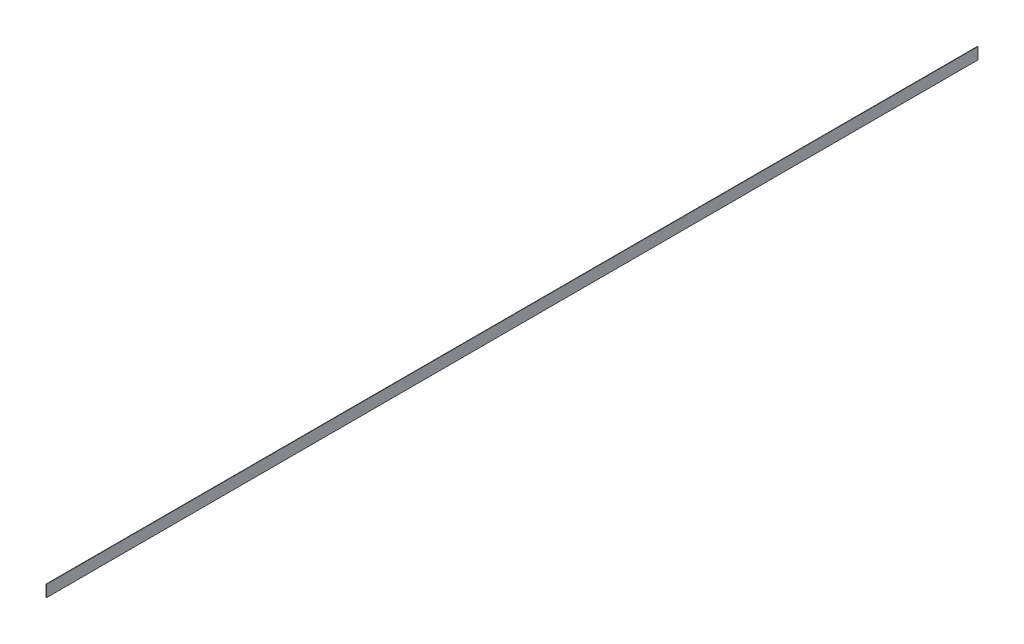
ISO-10303-21;
HEADER;
FILE_DESCRIPTION(('STEP AP214'),'2;1');
FILE_NAME('part.step','',(''),(''),'','','');
FILE_SCHEMA(('AUTOMOTIVE_DESIGN { 1 0 10303 214 1 1 1 1 }'));
ENDSEC;
DATA;
#1=APPLICATION_CONTEXT('core data for automotive mechanical design processes');
#2=APPLICATION_PROTOCOL_DEFINITION('international standard','automotive_design',2000,#1);
#3=PRODUCT_CONTEXT('',#1,'mechanical');
#4=PRODUCT('Part','Part','',(#3));
#5=PRODUCT_RELATED_PRODUCT_CATEGORY('part','',(#4));
#6=PRODUCT_DEFINITION_FORMATION('','',#4);
#7=PRODUCT_DEFINITION_CONTEXT('part definition',#1,'design');
#8=PRODUCT_DEFINITION('design','',#6,#7);
#9=PRODUCT_DEFINITION_SHAPE('','',#8);
#10=(LENGTH_UNIT() NAMED_UNIT(*) SI_UNIT(.MILLI.,.METRE.));
#11=(NAMED_UNIT(*) PLANE_ANGLE_UNIT() SI_UNIT($,.RADIAN.));
#12=(NAMED_UNIT(*) SI_UNIT($,.STERADIAN.) SOLID_ANGLE_UNIT());
#13=UNCERTAINTY_MEASURE_WITH_UNIT(LENGTH_MEASURE(1.E-05),#10,'distance_accuracy_value','');
#14=(GEOMETRIC_REPRESENTATION_CONTEXT(3) GLOBAL_UNCERTAINTY_ASSIGNED_CONTEXT((#13)) GLOBAL_UNIT_ASSIGNED_CONTEXT((#10,
#11,#12)) REPRESENTATION_CONTEXT('',''));
#15=CARTESIAN_POINT('',(0.,0.,0.));
#16=DIRECTION('',(0.,0.,1.));
#17=DIRECTION('',(1.,0.,0.));
#18=AXIS2_PLACEMENT_3D('',#15,#16,#17);
#19=CARTESIAN_POINT('',(0.,0.,0.));
#20=DIRECTION('',(0.,0.,-1.));
#21=DIRECTION('',(0.,-1.,0.));
#22=AXIS2_PLACEMENT_3D('',#19,#20,#21);
#23=PLANE('',#22);
#24=DIRECTION('',(0.,-1.,0.));
#25=VECTOR('',#24,1.);
#26=CARTESIAN_POINT('',(0.200000000000007,6.,0.));
#27=LINE('',#26,#25);
#28=CARTESIAN_POINT('',(0.200000000000007,6.,0.));
#29=VERTEX_POINT('',#28);
#30=CARTESIAN_POINT('',(0.2,0.,0.));
#31=VERTEX_POINT('',#30);
#32=EDGE_CURVE('E83',#29,#31,#27,.T.);
#33=ORIENTED_EDGE('',*,*,#32,.T.);
#34=DIRECTION('',(-1.,0.,0.));
#35=VECTOR('',#34,1.);
#36=CARTESIAN_POINT('',(0.2,0.,0.));
#37=LINE('',#36,#35);
#38=CARTESIAN_POINT('',(0.,0.,0.));
#39=VERTEX_POINT('',#38);
#40=EDGE_CURVE('E92',#31,#39,#37,.T.);
#41=ORIENTED_EDGE('',*,*,#40,.T.);
#42=DIRECTION('',(0.,1.,0.));
#43=VECTOR('',#42,1.);
#44=CARTESIAN_POINT('',(0.,0.,0.));
#45=LINE('',#44,#43);
#46=CARTESIAN_POINT('',(0.,6.,0.));
#47=VERTEX_POINT('',#46);
#48=EDGE_CURVE('E105',#39,#47,#45,.T.);
#49=ORIENTED_EDGE('',*,*,#48,.T.);
#50=DIRECTION('',(1.,0.,0.));
#51=VECTOR('',#50,1.);
#52=CARTESIAN_POINT('',(0.,6.,0.));
#53=LINE('',#52,#51);
#54=EDGE_CURVE('E26',#47,#29,#53,.T.);
#55=ORIENTED_EDGE('',*,*,#54,.T.);
#56=EDGE_LOOP('',(#33,#41,#49,#55));
#57=FACE_BOUND('',#56,.T.);
#58=ADVANCED_FACE('F16',(#57),#23,.T.);
#59=CARTESIAN_POINT('',(0.,0.,480.));
#60=DIRECTION('',(0.,0.,-1.));
#61=DIRECTION('',(0.,-1.,0.));
#62=AXIS2_PLACEMENT_3D('',#59,#60,#61);
#63=PLANE('',#62);
#64=DIRECTION('',(0.,-1.,0.));
#65=VECTOR('',#64,1.);
#66=CARTESIAN_POINT('',(0.200000000000007,6.,480.));
#67=LINE('',#66,#65);
#68=CARTESIAN_POINT('',(0.200000000000007,6.,480.));
#69=VERTEX_POINT('',#68);
#70=CARTESIAN_POINT('',(0.2,0.,480.));
#71=VERTEX_POINT('',#70);
#72=EDGE_CURVE('E72',#69,#71,#67,.T.);
#73=ORIENTED_EDGE('',*,*,#72,.F.);
#74=DIRECTION('',(1.,0.,0.));
#75=VECTOR('',#74,1.);
#76=CARTESIAN_POINT('',(0.,6.,480.));
#77=LINE('',#76,#75);
#78=CARTESIAN_POINT('',(0.,6.,480.));
#79=VERTEX_POINT('',#78);
#80=EDGE_CURVE('E11',#79,#69,#77,.T.);
#81=ORIENTED_EDGE('',*,*,#80,.F.);
#82=DIRECTION('',(0.,1.,0.));
#83=VECTOR('',#82,1.);
#84=CARTESIAN_POINT('',(0.,0.,480.));
#85=LINE('',#84,#83);
#86=CARTESIAN_POINT('',(0.,0.,480.));
#87=VERTEX_POINT('',#86);
#88=EDGE_CURVE('E111',#87,#79,#85,.T.);
#89=ORIENTED_EDGE('',*,*,#88,.F.);
#90=DIRECTION('',(-1.,0.,0.));
#91=VECTOR('',#90,1.);
#92=CARTESIAN_POINT('',(0.2,0.,480.));
#93=LINE('',#92,#91);
#94=EDGE_CURVE('E20',#71,#87,#93,.T.);
#95=ORIENTED_EDGE('',*,*,#94,.F.);
#96=EDGE_LOOP('',(#73,#81,#89,#95));
#97=FACE_BOUND('',#96,.T.);
#98=ADVANCED_FACE('F73',(#97),#63,.F.);
#99=CARTESIAN_POINT('',(0.,6.,480.));
#100=DIRECTION('',(0.,1.,0.));
#101=DIRECTION('',(1.,0.,0.));
#102=AXIS2_PLACEMENT_3D('',#99,#100,#101);
#103=PLANE('',#102);
#104=ORIENTED_EDGE('',*,*,#54,.F.);
#105=DIRECTION('',(0.,0.,-1.));
#106=VECTOR('',#105,1.);
#107=CARTESIAN_POINT('',(0.,6.,480.));
#108=LINE('',#107,#106);
#109=EDGE_CURVE('E69',#79,#47,#108,.T.);
#110=ORIENTED_EDGE('',*,*,#109,.F.);
#111=ORIENTED_EDGE('',*,*,#80,.T.);
#112=DIRECTION('',(0.,0.,-1.));
#113=VECTOR('',#112,1.);
#114=CARTESIAN_POINT('',(0.200000000000007,6.,480.));
#115=LINE('',#114,#113);
#116=EDGE_CURVE('E67',#69,#29,#115,.T.);
#117=ORIENTED_EDGE('',*,*,#116,.T.);
#118=EDGE_LOOP('',(#104,#110,#111,#117));
#119=FACE_BOUND('',#118,.T.);
#120=ADVANCED_FACE('F65',(#119),#103,.T.);
#121=CARTESIAN_POINT('',(0.,0.,480.));
#122=DIRECTION('',(-1.,0.,0.));
#123=DIRECTION('',(0.,0.,1.));
#124=AXIS2_PLACEMENT_3D('',#121,#122,#123);
#125=PLANE('',#124);
#126=ORIENTED_EDGE('',*,*,#48,.F.);
#127=DIRECTION('',(0.,0.,-1.));
#128=VECTOR('',#127,1.);
#129=CARTESIAN_POINT('',(0.,0.,480.));
#130=LINE('',#129,#128);
#131=EDGE_CURVE('E99',#87,#39,#130,.T.);
#132=ORIENTED_EDGE('',*,*,#131,.F.);
#133=ORIENTED_EDGE('',*,*,#88,.T.);
#134=ORIENTED_EDGE('',*,*,#109,.T.);
#135=EDGE_LOOP('',(#126,#132,#133,#134));
#136=FACE_BOUND('',#135,.T.);
#137=ADVANCED_FACE('F129',(#136),#125,.T.);
#138=CARTESIAN_POINT('',(0.2,0.,480.));
#139=DIRECTION('',(0.,-1.,0.));
#140=DIRECTION('',(0.,0.,-1.));
#141=AXIS2_PLACEMENT_3D('',#138,#139,#140);
#142=PLANE('',#141);
#143=ORIENTED_EDGE('',*,*,#40,.F.);
#144=DIRECTION('',(0.,0.,-1.));
#145=VECTOR('',#144,1.);
#146=CARTESIAN_POINT('',(0.2,0.,480.));
#147=LINE('',#146,#145);
#148=EDGE_CURVE('E79',#71,#31,#147,.T.);
#149=ORIENTED_EDGE('',*,*,#148,.F.);
#150=ORIENTED_EDGE('',*,*,#94,.T.);
#151=ORIENTED_EDGE('',*,*,#131,.T.);
#152=EDGE_LOOP('',(#143,#149,#150,#151));
#153=FACE_BOUND('',#152,.T.);
#154=ADVANCED_FACE('F18',(#153),#142,.T.);
#155=CARTESIAN_POINT('',(0.200000000000007,6.,480.));
#156=DIRECTION('',(1.,0.,0.));
#157=DIRECTION('',(0.,-1.,0.));
#158=AXIS2_PLACEMENT_3D('',#155,#156,#157);
#159=PLANE('',#158);
#160=ORIENTED_EDGE('',*,*,#32,.F.);
#161=ORIENTED_EDGE('',*,*,#116,.F.);
#162=ORIENTED_EDGE('',*,*,#72,.T.);
#163=ORIENTED_EDGE('',*,*,#148,.T.);
#164=EDGE_LOOP('',(#160,#161,#162,#163));
#165=FACE_BOUND('',#164,.T.);
#166=ADVANCED_FACE('F81',(#165),#159,.T.);
#167=CLOSED_SHELL('',(#58,#98,#120,#137,#154,#166));
#168=MANIFOLD_SOLID_BREP('B1',#167);
#169=ADVANCED_BREP_SHAPE_REPRESENTATION('',(#18,#168),#14);
#170=SHAPE_DEFINITION_REPRESENTATION(#9,#169);
ENDSEC;
END-ISO-10303-21;
